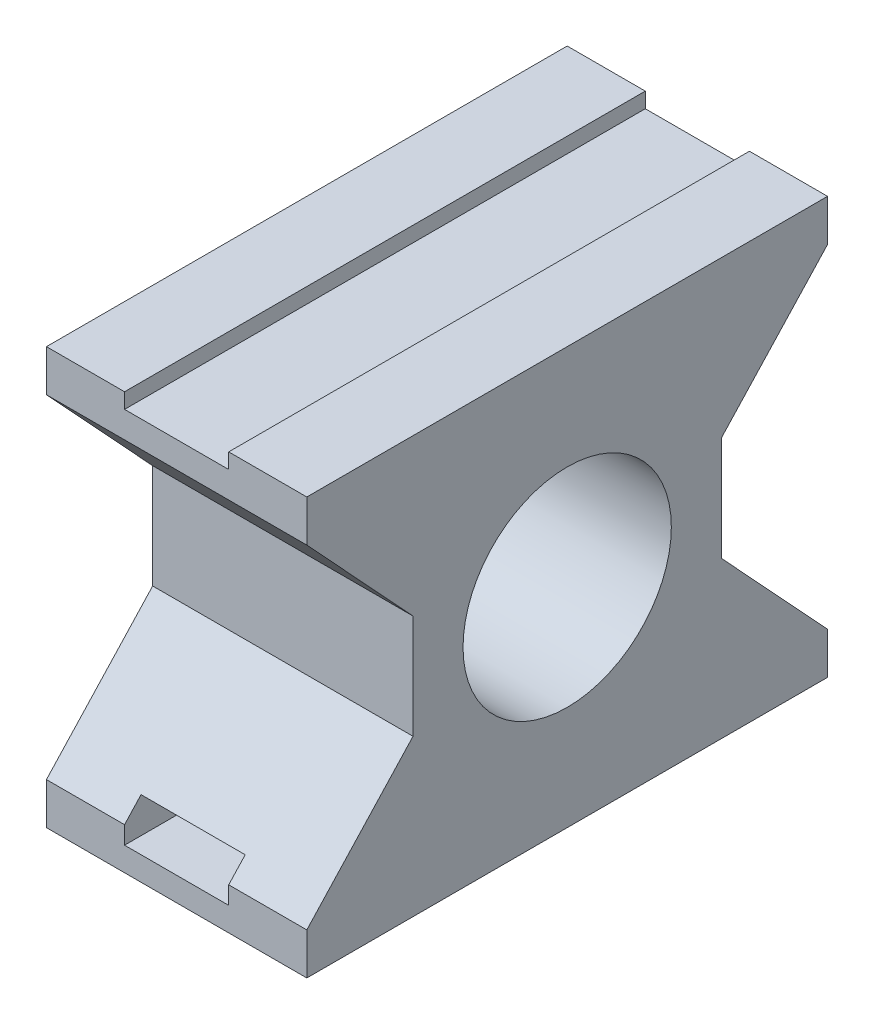
ISO-10303-21;
HEADER;
FILE_DESCRIPTION(('STEP AP214'),'2;1');
FILE_NAME('part.step','',(''),(''),'','','');
FILE_SCHEMA(('AUTOMOTIVE_DESIGN { 1 0 10303 214 1 1 1 1 }'));
ENDSEC;
DATA;
#1=APPLICATION_CONTEXT('core data for automotive mechanical design processes');
#2=APPLICATION_PROTOCOL_DEFINITION('international standard','automotive_design',2000,#1);
#3=PRODUCT_CONTEXT('',#1,'mechanical');
#4=PRODUCT('Part','Part','',(#3));
#5=PRODUCT_RELATED_PRODUCT_CATEGORY('part','',(#4));
#6=PRODUCT_DEFINITION_FORMATION('','',#4);
#7=PRODUCT_DEFINITION_CONTEXT('part definition',#1,'design');
#8=PRODUCT_DEFINITION('design','',#6,#7);
#9=PRODUCT_DEFINITION_SHAPE('','',#8);
#10=(LENGTH_UNIT() NAMED_UNIT(*) SI_UNIT(.MILLI.,.METRE.));
#11=(NAMED_UNIT(*) PLANE_ANGLE_UNIT() SI_UNIT($,.RADIAN.));
#12=(NAMED_UNIT(*) SI_UNIT($,.STERADIAN.) SOLID_ANGLE_UNIT());
#13=UNCERTAINTY_MEASURE_WITH_UNIT(LENGTH_MEASURE(1.E-05),#10,'distance_accuracy_value','');
#14=(GEOMETRIC_REPRESENTATION_CONTEXT(3) GLOBAL_UNCERTAINTY_ASSIGNED_CONTEXT((#13)) GLOBAL_UNIT_ASSIGNED_CONTEXT((#10,
#11,#12)) REPRESENTATION_CONTEXT('',''));
#15=CARTESIAN_POINT('',(0.,0.,0.));
#16=DIRECTION('',(0.,0.,1.));
#17=DIRECTION('',(1.,0.,0.));
#18=AXIS2_PLACEMENT_3D('',#15,#16,#17);
#19=CARTESIAN_POINT('',(50.,40.7131379883337,-29.5249111611344));
#20=DIRECTION('',(0.,-1.,0.));
#21=DIRECTION('',(0.,0.,-1.));
#22=AXIS2_PLACEMENT_3D('',#19,#20,#21);
#23=PLANE('',#22);
#24=DIRECTION('',(-1.,0.,0.));
#25=VECTOR('',#24,1.);
#26=CARTESIAN_POINT('',(50.,40.7131379883337,-29.5249111611344));
#27=LINE('',#26,#25);
#28=CARTESIAN_POINT('',(50.,40.7131379883337,-29.5249111611344));
#29=VERTEX_POINT('',#28);
#30=CARTESIAN_POINT('',(35.,40.7131379883337,-29.5249111611344));
#31=VERTEX_POINT('',#30);
#32=EDGE_CURVE('E310',#29,#31,#27,.T.);
#33=ORIENTED_EDGE('',*,*,#32,.T.);
#34=DIRECTION('',(0.,0.,1.));
#35=VECTOR('',#34,1.);
#36=CARTESIAN_POINT('',(35.,40.7131379883337,-29.5249111611344));
#37=LINE('',#36,#35);
#38=CARTESIAN_POINT('',(35.,40.7131379883337,70.4750888388656));
#39=VERTEX_POINT('',#38);
#40=EDGE_CURVE('E347',#31,#39,#37,.T.);
#41=ORIENTED_EDGE('',*,*,#40,.T.);
#42=DIRECTION('',(-1.,0.,0.));
#43=VECTOR('',#42,1.);
#44=CARTESIAN_POINT('',(50.,40.7131379883337,70.4750888388656));
#45=LINE('',#44,#43);
#46=CARTESIAN_POINT('',(50.,40.7131379883337,70.4750888388656));
#47=VERTEX_POINT('',#46);
#48=EDGE_CURVE('E307',#47,#39,#45,.T.);
#49=ORIENTED_EDGE('',*,*,#48,.F.);
#50=DIRECTION('',(0.,0.,1.));
#51=VECTOR('',#50,1.);
#52=CARTESIAN_POINT('',(50.,40.7131379883337,-29.5249111611344));
#53=LINE('',#52,#51);
#54=EDGE_CURVE('E278',#29,#47,#53,.T.);
#55=ORIENTED_EDGE('',*,*,#54,.F.);
#56=EDGE_LOOP('',(#33,#41,#49,#55));
#57=FACE_BOUND('',#56,.T.);
#58=ADVANCED_FACE('F33',(#57),#23,.F.);
#59=CARTESIAN_POINT('',(50.,0.,0.));
#60=DIRECTION('',(1.,0.,0.));
#61=DIRECTION('',(0.,0.,-1.));
#62=AXIS2_PLACEMENT_3D('',#59,#60,#61);
#63=PLANE('',#62);
#64=DIRECTION('',(0.,-1.,0.));
#65=VECTOR('',#64,1.);
#66=CARTESIAN_POINT('',(50.,40.7131379883337,70.4750888388656));
#67=LINE('',#66,#65);
#68=CARTESIAN_POINT('',(50.,32.7131379883336,70.4750888388656));
#69=VERTEX_POINT('',#68);
#70=EDGE_CURVE('E254',#47,#69,#67,.T.);
#71=ORIENTED_EDGE('',*,*,#70,.T.);
#72=DIRECTION('',(0.,-0.733333333333334,-0.679869268479038));
#73=VECTOR('',#72,1.);
#74=CARTESIAN_POINT('',(50.,32.7131379883336,70.4750888388656));
#75=LINE('',#74,#73);
#76=CARTESIAN_POINT('',(50.,10.7131379883337,50.0790107844945));
#77=VERTEX_POINT('',#76);
#78=EDGE_CURVE('E257',#69,#77,#75,.T.);
#79=ORIENTED_EDGE('',*,*,#78,.T.);
#80=DIRECTION('',(0.,-1.,0.));
#81=VECTOR('',#80,1.);
#82=CARTESIAN_POINT('',(50.,10.7131379883337,50.0790107844945));
#83=LINE('',#82,#81);
#84=CARTESIAN_POINT('',(50.,-9.28686201166634,50.0790107844945));
#85=VERTEX_POINT('',#84);
#86=EDGE_CURVE('E260',#77,#85,#83,.T.);
#87=ORIENTED_EDGE('',*,*,#86,.T.);
#88=DIRECTION('',(0.,-0.733333333333334,0.679869268479038));
#89=VECTOR('',#88,1.);
#90=CARTESIAN_POINT('',(50.,-9.28686201166634,50.0790107844945));
#91=LINE('',#90,#89);
#92=CARTESIAN_POINT('',(50.,-31.2868620116663,70.4750888388656));
#93=VERTEX_POINT('',#92);
#94=EDGE_CURVE('E262',#85,#93,#91,.T.);
#95=ORIENTED_EDGE('',*,*,#94,.T.);
#96=DIRECTION('',(0.,-1.,0.));
#97=VECTOR('',#96,1.);
#98=CARTESIAN_POINT('',(50.,-31.2868620116663,70.4750888388656));
#99=LINE('',#98,#97);
#100=CARTESIAN_POINT('',(50.,-39.2868620116664,70.4750888388656));
#101=VERTEX_POINT('',#100);
#102=EDGE_CURVE('E264',#93,#101,#99,.T.);
#103=ORIENTED_EDGE('',*,*,#102,.T.);
#104=DIRECTION('',(0.,0.,-1.));
#105=VECTOR('',#104,1.);
#106=CARTESIAN_POINT('',(50.,-39.2868620116664,70.4750888388656));
#107=LINE('',#106,#105);
#108=CARTESIAN_POINT('',(50.,-39.2868620116664,-29.5249111611344));
#109=VERTEX_POINT('',#108);
#110=EDGE_CURVE('E266',#101,#109,#107,.T.);
#111=ORIENTED_EDGE('',*,*,#110,.T.);
#112=DIRECTION('',(0.,1.,0.));
#113=VECTOR('',#112,1.);
#114=CARTESIAN_POINT('',(50.,-31.2868620116663,-29.5249111611344));
#115=LINE('',#114,#113);
#116=CARTESIAN_POINT('',(50.,-31.2868620116663,-29.5249111611344));
#117=VERTEX_POINT('',#116);
#118=EDGE_CURVE('E268',#109,#117,#115,.T.);
#119=ORIENTED_EDGE('',*,*,#118,.T.);
#120=DIRECTION('',(0.,0.733333333333334,0.679869268479038));
#121=VECTOR('',#120,1.);
#122=CARTESIAN_POINT('',(50.,-9.28686201166634,-9.1288331067633));
#123=LINE('',#122,#121);
#124=CARTESIAN_POINT('',(50.,-9.28686201166634,-9.1288331067633));
#125=VERTEX_POINT('',#124);
#126=EDGE_CURVE('E270',#117,#125,#123,.T.);
#127=ORIENTED_EDGE('',*,*,#126,.T.);
#128=DIRECTION('',(0.,1.,0.));
#129=VECTOR('',#128,1.);
#130=CARTESIAN_POINT('',(50.,10.7131379883337,-9.1288331067633));
#131=LINE('',#130,#129);
#132=CARTESIAN_POINT('',(50.,10.7131379883337,-9.1288331067633));
#133=VERTEX_POINT('',#132);
#134=EDGE_CURVE('E272',#125,#133,#131,.T.);
#135=ORIENTED_EDGE('',*,*,#134,.T.);
#136=DIRECTION('',(0.,0.733333333333334,-0.679869268479038));
#137=VECTOR('',#136,1.);
#138=CARTESIAN_POINT('',(50.,32.7131379883336,-29.5249111611344));
#139=LINE('',#138,#137);
#140=CARTESIAN_POINT('',(50.,32.7131379883336,-29.5249111611344));
#141=VERTEX_POINT('',#140);
#142=EDGE_CURVE('E274',#133,#141,#139,.T.);
#143=ORIENTED_EDGE('',*,*,#142,.T.);
#144=DIRECTION('',(0.,1.,0.));
#145=VECTOR('',#144,1.);
#146=CARTESIAN_POINT('',(50.,40.7131379883337,-29.5249111611344));
#147=LINE('',#146,#145);
#148=EDGE_CURVE('E276',#141,#29,#147,.T.);
#149=ORIENTED_EDGE('',*,*,#148,.T.);
#150=ORIENTED_EDGE('',*,*,#54,.T.);
#151=EDGE_LOOP('',(#71,#79,#87,#95,#103,#111,#119,#127,#135,#143,#149,#150));
#152=FACE_BOUND('',#151,.T.);
#153=CARTESIAN_POINT('',(50.,0.713137988333654,20.4750888388656));
#154=DIRECTION('',(1.,0.,0.));
#155=DIRECTION('',(0.,0.,-1.));
#156=AXIS2_PLACEMENT_3D('',#153,#154,#155);
#157=CIRCLE('',#156,20.);
#158=CARTESIAN_POINT('',(50.,0.713137988333654,0.475088838865576));
#159=VERTEX_POINT('',#158);
#160=EDGE_CURVE('E248',#159,#159,#157,.T.);
#161=ORIENTED_EDGE('',*,*,#160,.F.);
#162=EDGE_LOOP('',(#161));
#163=FACE_BOUND('',#162,.T.);
#164=ADVANCED_FACE('F377',(#152,#163),#63,.T.);
#165=CARTESIAN_POINT('',(0.,0.,0.));
#166=DIRECTION('',(1.,0.,0.));
#167=DIRECTION('',(0.,0.,-1.));
#168=AXIS2_PLACEMENT_3D('',#165,#166,#167);
#169=PLANE('',#168);
#170=DIRECTION('',(0.,-1.,0.));
#171=VECTOR('',#170,1.);
#172=CARTESIAN_POINT('',(0.,40.7131379883337,70.4750888388656));
#173=LINE('',#172,#171);
#174=CARTESIAN_POINT('',(0.,40.7131379883337,70.4750888388656));
#175=VERTEX_POINT('',#174);
#176=CARTESIAN_POINT('',(0.,32.7131379883336,70.4750888388656));
#177=VERTEX_POINT('',#176);
#178=EDGE_CURVE('E251',#175,#177,#173,.T.);
#179=ORIENTED_EDGE('',*,*,#178,.F.);
#180=DIRECTION('',(0.,0.,1.));
#181=VECTOR('',#180,1.);
#182=CARTESIAN_POINT('',(0.,40.7131379883337,-29.5249111611344));
#183=LINE('',#182,#181);
#184=CARTESIAN_POINT('',(0.,40.7131379883337,-29.5249111611344));
#185=VERTEX_POINT('',#184);
#186=EDGE_CURVE('E258',#185,#175,#183,.T.);
#187=ORIENTED_EDGE('',*,*,#186,.F.);
#188=DIRECTION('',(0.,1.,0.));
#189=VECTOR('',#188,1.);
#190=CARTESIAN_POINT('',(0.,40.7131379883337,-29.5249111611344));
#191=LINE('',#190,#189);
#192=CARTESIAN_POINT('',(0.,32.7131379883336,-29.5249111611344));
#193=VERTEX_POINT('',#192);
#194=EDGE_CURVE('E303',#193,#185,#191,.T.);
#195=ORIENTED_EDGE('',*,*,#194,.F.);
#196=DIRECTION('',(0.,0.733333333333334,-0.679869268479038));
#197=VECTOR('',#196,1.);
#198=CARTESIAN_POINT('',(0.,32.7131379883336,-29.5249111611344));
#199=LINE('',#198,#197);
#200=CARTESIAN_POINT('',(0.,10.7131379883337,-9.1288331067633));
#201=VERTEX_POINT('',#200);
#202=EDGE_CURVE('E301',#201,#193,#199,.T.);
#203=ORIENTED_EDGE('',*,*,#202,.F.);
#204=DIRECTION('',(0.,1.,0.));
#205=VECTOR('',#204,1.);
#206=CARTESIAN_POINT('',(0.,10.7131379883337,-9.1288331067633));
#207=LINE('',#206,#205);
#208=CARTESIAN_POINT('',(0.,-9.28686201166634,-9.1288331067633));
#209=VERTEX_POINT('',#208);
#210=EDGE_CURVE('E299',#209,#201,#207,.T.);
#211=ORIENTED_EDGE('',*,*,#210,.F.);
#212=DIRECTION('',(0.,0.733333333333334,0.679869268479038));
#213=VECTOR('',#212,1.);
#214=CARTESIAN_POINT('',(0.,-9.28686201166634,-9.1288331067633));
#215=LINE('',#214,#213);
#216=CARTESIAN_POINT('',(0.,-31.2868620116663,-29.5249111611344));
#217=VERTEX_POINT('',#216);
#218=EDGE_CURVE('E297',#217,#209,#215,.T.);
#219=ORIENTED_EDGE('',*,*,#218,.F.);
#220=DIRECTION('',(0.,1.,0.));
#221=VECTOR('',#220,1.);
#222=CARTESIAN_POINT('',(0.,-31.2868620116663,-29.5249111611344));
#223=LINE('',#222,#221);
#224=CARTESIAN_POINT('',(0.,-39.2868620116664,-29.5249111611344));
#225=VERTEX_POINT('',#224);
#226=EDGE_CURVE('E294',#225,#217,#223,.T.);
#227=ORIENTED_EDGE('',*,*,#226,.F.);
#228=DIRECTION('',(0.,0.,-1.));
#229=VECTOR('',#228,1.);
#230=CARTESIAN_POINT('',(0.,-39.2868620116664,70.4750888388656));
#231=LINE('',#230,#229);
#232=CARTESIAN_POINT('',(0.,-39.2868620116664,70.4750888388656));
#233=VERTEX_POINT('',#232);
#234=EDGE_CURVE('E292',#233,#225,#231,.T.);
#235=ORIENTED_EDGE('',*,*,#234,.F.);
#236=DIRECTION('',(0.,-1.,0.));
#237=VECTOR('',#236,1.);
#238=CARTESIAN_POINT('',(0.,-31.2868620116663,70.4750888388656));
#239=LINE('',#238,#237);
#240=CARTESIAN_POINT('',(0.,-31.2868620116663,70.4750888388656));
#241=VERTEX_POINT('',#240);
#242=EDGE_CURVE('E290',#241,#233,#239,.T.);
#243=ORIENTED_EDGE('',*,*,#242,.F.);
#244=DIRECTION('',(0.,-0.733333333333334,0.679869268479038));
#245=VECTOR('',#244,1.);
#246=CARTESIAN_POINT('',(0.,-9.28686201166634,50.0790107844945));
#247=LINE('',#246,#245);
#248=CARTESIAN_POINT('',(0.,-9.28686201166634,50.0790107844945));
#249=VERTEX_POINT('',#248);
#250=EDGE_CURVE('E287',#249,#241,#247,.T.);
#251=ORIENTED_EDGE('',*,*,#250,.F.);
#252=DIRECTION('',(0.,-1.,0.));
#253=VECTOR('',#252,1.);
#254=CARTESIAN_POINT('',(0.,10.7131379883337,50.0790107844945));
#255=LINE('',#254,#253);
#256=CARTESIAN_POINT('',(0.,10.7131379883337,50.0790107844945));
#257=VERTEX_POINT('',#256);
#258=EDGE_CURVE('E285',#257,#249,#255,.T.);
#259=ORIENTED_EDGE('',*,*,#258,.F.);
#260=DIRECTION('',(0.,-0.733333333333334,-0.679869268479038));
#261=VECTOR('',#260,1.);
#262=CARTESIAN_POINT('',(0.,32.7131379883336,70.4750888388656));
#263=LINE('',#262,#261);
#264=EDGE_CURVE('E283',#177,#257,#263,.T.);
#265=ORIENTED_EDGE('',*,*,#264,.F.);
#266=EDGE_LOOP('',(#179,#187,#195,#203,#211,#219,#227,#235,#243,#251,#259,#265));
#267=FACE_BOUND('',#266,.T.);
#268=CARTESIAN_POINT('',(0.,0.713137988333654,20.4750888388656));
#269=DIRECTION('',(1.,0.,0.));
#270=DIRECTION('',(0.,0.,-1.));
#271=AXIS2_PLACEMENT_3D('',#268,#269,#270);
#272=CIRCLE('',#271,20.);
#273=CARTESIAN_POINT('',(0.,0.713137988333654,0.475088838865576));
#274=VERTEX_POINT('',#273);
#275=EDGE_CURVE('E247',#274,#274,#272,.T.);
#276=ORIENTED_EDGE('',*,*,#275,.T.);
#277=EDGE_LOOP('',(#276));
#278=FACE_BOUND('',#277,.T.);
#279=ADVANCED_FACE('F366',(#267,#278),#169,.F.);
#280=CARTESIAN_POINT('',(50.,40.7131379883337,70.4750888388656));
#281=DIRECTION('',(0.,0.,-1.));
#282=DIRECTION('',(-1.,0.,0.));
#283=AXIS2_PLACEMENT_3D('',#280,#281,#282);
#284=PLANE('',#283);
#285=ORIENTED_EDGE('',*,*,#48,.T.);
#286=DIRECTION('',(0.,1.,0.));
#287=VECTOR('',#286,1.);
#288=CARTESIAN_POINT('',(35.,43.6468692656229,70.4750888388656));
#289=LINE('',#288,#287);
#290=CARTESIAN_POINT('',(35.,37.7794067110444,70.4750888388656));
#291=VERTEX_POINT('',#290);
#292=EDGE_CURVE('E210',#291,#39,#289,.T.);
#293=ORIENTED_EDGE('',*,*,#292,.F.);
#294=DIRECTION('',(1.,0.,0.));
#295=VECTOR('',#294,1.);
#296=CARTESIAN_POINT('',(15.,37.7794067110444,70.4750888388656));
#297=LINE('',#296,#295);
#298=CARTESIAN_POINT('',(15.,37.7794067110444,70.4750888388656));
#299=VERTEX_POINT('',#298);
#300=EDGE_CURVE('E207',#299,#291,#297,.T.);
#301=ORIENTED_EDGE('',*,*,#300,.F.);
#302=DIRECTION('',(0.,-1.,0.));
#303=VECTOR('',#302,1.);
#304=CARTESIAN_POINT('',(15.,43.6468692656229,70.4750888388656));
#305=LINE('',#304,#303);
#306=CARTESIAN_POINT('',(15.,40.7131379883337,70.4750888388656));
#307=VERTEX_POINT('',#306);
#308=EDGE_CURVE('E188',#307,#299,#305,.T.);
#309=ORIENTED_EDGE('',*,*,#308,.F.);
#310=EDGE_CURVE('E280',#307,#175,#45,.T.);
#311=ORIENTED_EDGE('',*,*,#310,.T.);
#312=ORIENTED_EDGE('',*,*,#178,.T.);
#313=DIRECTION('',(-1.,0.,0.));
#314=VECTOR('',#313,1.);
#315=CARTESIAN_POINT('',(50.,32.7131379883336,70.4750888388656));
#316=LINE('',#315,#314);
#317=EDGE_CURVE('E342',#69,#177,#316,.T.);
#318=ORIENTED_EDGE('',*,*,#317,.F.);
#319=ORIENTED_EDGE('',*,*,#70,.F.);
#320=EDGE_LOOP('',(#285,#293,#301,#309,#311,#312,#318,#319));
#321=FACE_BOUND('',#320,.T.);
#322=ADVANCED_FACE('F35',(#321),#284,.F.);
#323=CARTESIAN_POINT('',(50.,32.7131379883336,70.4750888388656));
#324=DIRECTION('',(0.,0.679869268479038,-0.733333333333334));
#325=DIRECTION('',(0.,0.733333333333334,0.679869268479038));
#326=AXIS2_PLACEMENT_3D('',#323,#324,#325);
#327=PLANE('',#326);
#328=ORIENTED_EDGE('',*,*,#264,.T.);
#329=DIRECTION('',(-1.,0.,0.));
#330=VECTOR('',#329,1.);
#331=CARTESIAN_POINT('',(50.,10.7131379883337,50.0790107844945));
#332=LINE('',#331,#330);
#333=EDGE_CURVE('E339',#77,#257,#332,.T.);
#334=ORIENTED_EDGE('',*,*,#333,.F.);
#335=ORIENTED_EDGE('',*,*,#78,.F.);
#336=ORIENTED_EDGE('',*,*,#317,.T.);
#337=EDGE_LOOP('',(#328,#334,#335,#336));
#338=FACE_BOUND('',#337,.T.);
#339=ADVANCED_FACE('F454',(#338),#327,.F.);
#340=CARTESIAN_POINT('',(50.,10.7131379883337,50.0790107844945));
#341=DIRECTION('',(0.,0.,-1.));
#342=DIRECTION('',(0.,1.,0.));
#343=AXIS2_PLACEMENT_3D('',#340,#341,#342);
#344=PLANE('',#343);
#345=ORIENTED_EDGE('',*,*,#258,.T.);
#346=DIRECTION('',(-1.,0.,0.));
#347=VECTOR('',#346,1.);
#348=CARTESIAN_POINT('',(50.,-9.28686201166634,50.0790107844945));
#349=LINE('',#348,#347);
#350=EDGE_CURVE('E336',#85,#249,#349,.T.);
#351=ORIENTED_EDGE('',*,*,#350,.F.);
#352=ORIENTED_EDGE('',*,*,#86,.F.);
#353=ORIENTED_EDGE('',*,*,#333,.T.);
#354=EDGE_LOOP('',(#345,#351,#352,#353));
#355=FACE_BOUND('',#354,.T.);
#356=ADVANCED_FACE('F407',(#355),#344,.F.);
#357=CARTESIAN_POINT('',(50.,-9.28686201166634,50.0790107844945));
#358=DIRECTION('',(0.,-0.679869268479038,-0.733333333333334));
#359=DIRECTION('',(0.,0.733333333333334,-0.679869268479038));
#360=AXIS2_PLACEMENT_3D('',#357,#358,#359);
#361=PLANE('',#360);
#362=DIRECTION('',(1.,0.,0.));
#363=VECTOR('',#362,1.);
#364=CARTESIAN_POINT('',(50.,-27.8720607072948,67.3092454777688));
#365=LINE('',#364,#363);
#366=CARTESIAN_POINT('',(15.,-27.8720607072948,67.3092454777688));
#367=VERTEX_POINT('',#366);
#368=CARTESIAN_POINT('',(35.,-27.8720607072948,67.3092454777688));
#369=VERTEX_POINT('',#368);
#370=EDGE_CURVE('E215',#367,#369,#365,.T.);
#371=ORIENTED_EDGE('',*,*,#370,.T.);
#372=DIRECTION('',(0.,-0.733333333333334,0.679869268479038));
#373=VECTOR('',#372,1.);
#374=CARTESIAN_POINT('',(35.0000000000001,-9.28686201166633,50.0790107844944));
#375=LINE('',#374,#373);
#376=CARTESIAN_POINT('',(35.,-31.2868620116663,70.4750888388656));
#377=VERTEX_POINT('',#376);
#378=EDGE_CURVE('E244',#369,#377,#375,.T.);
#379=ORIENTED_EDGE('',*,*,#378,.T.);
#380=DIRECTION('',(-1.,0.,0.));
#381=VECTOR('',#380,1.);
#382=CARTESIAN_POINT('',(50.,-31.2868620116663,70.4750888388656));
#383=LINE('',#382,#381);
#384=EDGE_CURVE('E333',#93,#377,#383,.T.);
#385=ORIENTED_EDGE('',*,*,#384,.F.);
#386=ORIENTED_EDGE('',*,*,#94,.F.);
#387=ORIENTED_EDGE('',*,*,#350,.T.);
#388=ORIENTED_EDGE('',*,*,#250,.T.);
#389=CARTESIAN_POINT('',(15.,-31.2868620116663,70.4750888388656));
#390=VERTEX_POINT('',#389);
#391=EDGE_CURVE('E332',#390,#241,#383,.T.);
#392=ORIENTED_EDGE('',*,*,#391,.F.);
#393=DIRECTION('',(0.,0.733333333333334,-0.679869268479038));
#394=VECTOR('',#393,1.);
#395=CARTESIAN_POINT('',(15.,-9.28686201166634,50.0790107844945));
#396=LINE('',#395,#394);
#397=EDGE_CURVE('E48',#390,#367,#396,.T.);
#398=ORIENTED_EDGE('',*,*,#397,.T.);
#399=EDGE_LOOP('',(#371,#379,#385,#386,#387,#388,#392,#398));
#400=FACE_BOUND('',#399,.T.);
#401=ADVANCED_FACE('F388',(#400),#361,.F.);
#402=CARTESIAN_POINT('',(50.,-31.2868620116663,70.4750888388656));
#403=DIRECTION('',(0.,0.,-1.));
#404=DIRECTION('',(-1.,0.,0.));
#405=AXIS2_PLACEMENT_3D('',#402,#403,#404);
#406=PLANE('',#405);
#407=ORIENTED_EDGE('',*,*,#384,.T.);
#408=DIRECTION('',(0.,1.,0.));
#409=VECTOR('',#408,1.);
#410=CARTESIAN_POINT('',(35.,-27.8720607072948,70.4750888388656));
#411=LINE('',#410,#409);
#412=CARTESIAN_POINT('',(35.,-34.7016633160379,70.4750888388656));
#413=VERTEX_POINT('',#412);
#414=EDGE_CURVE('E228',#413,#377,#411,.T.);
#415=ORIENTED_EDGE('',*,*,#414,.F.);
#416=DIRECTION('',(1.,0.,0.));
#417=VECTOR('',#416,1.);
#418=CARTESIAN_POINT('',(15.,-34.7016633160379,70.4750888388656));
#419=LINE('',#418,#417);
#420=CARTESIAN_POINT('',(15.,-34.7016633160379,70.4750888388656));
#421=VERTEX_POINT('',#420);
#422=EDGE_CURVE('E221',#421,#413,#419,.T.);
#423=ORIENTED_EDGE('',*,*,#422,.F.);
#424=DIRECTION('',(0.,-1.,0.));
#425=VECTOR('',#424,1.);
#426=CARTESIAN_POINT('',(15.,-27.8720607072948,70.4750888388656));
#427=LINE('',#426,#425);
#428=EDGE_CURVE('E230',#390,#421,#427,.T.);
#429=ORIENTED_EDGE('',*,*,#428,.F.);
#430=ORIENTED_EDGE('',*,*,#391,.T.);
#431=ORIENTED_EDGE('',*,*,#242,.T.);
#432=DIRECTION('',(-1.,0.,0.));
#433=VECTOR('',#432,1.);
#434=CARTESIAN_POINT('',(50.,-39.2868620116664,70.4750888388656));
#435=LINE('',#434,#433);
#436=EDGE_CURVE('E329',#101,#233,#435,.T.);
#437=ORIENTED_EDGE('',*,*,#436,.F.);
#438=ORIENTED_EDGE('',*,*,#102,.F.);
#439=EDGE_LOOP('',(#407,#415,#423,#429,#430,#431,#437,#438));
#440=FACE_BOUND('',#439,.T.);
#441=ADVANCED_FACE('F394',(#440),#406,.F.);
#442=CARTESIAN_POINT('',(50.,-39.2868620116664,70.4750888388656));
#443=DIRECTION('',(0.,1.,0.));
#444=DIRECTION('',(0.,0.,1.));
#445=AXIS2_PLACEMENT_3D('',#442,#443,#444);
#446=PLANE('',#445);
#447=ORIENTED_EDGE('',*,*,#234,.T.);
#448=DIRECTION('',(-1.,0.,0.));
#449=VECTOR('',#448,1.);
#450=CARTESIAN_POINT('',(50.,-39.2868620116664,-29.5249111611344));
#451=LINE('',#450,#449);
#452=EDGE_CURVE('E326',#109,#225,#451,.T.);
#453=ORIENTED_EDGE('',*,*,#452,.F.);
#454=ORIENTED_EDGE('',*,*,#110,.F.);
#455=ORIENTED_EDGE('',*,*,#436,.T.);
#456=EDGE_LOOP('',(#447,#453,#454,#455));
#457=FACE_BOUND('',#456,.T.);
#458=ADVANCED_FACE('F410',(#457),#446,.F.);
#459=CARTESIAN_POINT('',(50.,-31.2868620116663,-29.5249111611344));
#460=DIRECTION('',(0.,0.,1.));
#461=DIRECTION('',(1.,0.,0.));
#462=AXIS2_PLACEMENT_3D('',#459,#460,#461);
#463=PLANE('',#462);
#464=DIRECTION('',(1.,0.,0.));
#465=VECTOR('',#464,1.);
#466=CARTESIAN_POINT('',(15.,-34.7016633160379,-29.5249111611344));
#467=LINE('',#466,#465);
#468=CARTESIAN_POINT('',(15.,-34.7016633160379,-29.5249111611344));
#469=VERTEX_POINT('',#468);
#470=CARTESIAN_POINT('',(35.,-34.7016633160379,-29.5249111611344));
#471=VERTEX_POINT('',#470);
#472=EDGE_CURVE('E224',#469,#471,#467,.T.);
#473=ORIENTED_EDGE('',*,*,#472,.T.);
#474=DIRECTION('',(0.,1.,0.));
#475=VECTOR('',#474,1.);
#476=CARTESIAN_POINT('',(35.,-27.8720607072948,-29.5249111611344));
#477=LINE('',#476,#475);
#478=CARTESIAN_POINT('',(35.,-31.2868620116663,-29.5249111611344));
#479=VERTEX_POINT('',#478);
#480=EDGE_CURVE('E217',#471,#479,#477,.T.);
#481=ORIENTED_EDGE('',*,*,#480,.T.);
#482=DIRECTION('',(-1.,0.,0.));
#483=VECTOR('',#482,1.);
#484=CARTESIAN_POINT('',(50.,-31.2868620116663,-29.5249111611344));
#485=LINE('',#484,#483);
#486=EDGE_CURVE('E323',#117,#479,#485,.T.);
#487=ORIENTED_EDGE('',*,*,#486,.F.);
#488=ORIENTED_EDGE('',*,*,#118,.F.);
#489=ORIENTED_EDGE('',*,*,#452,.T.);
#490=ORIENTED_EDGE('',*,*,#226,.T.);
#491=CARTESIAN_POINT('',(15.,-31.2868620116663,-29.5249111611344));
#492=VERTEX_POINT('',#491);
#493=EDGE_CURVE('E322',#492,#217,#485,.T.);
#494=ORIENTED_EDGE('',*,*,#493,.F.);
#495=DIRECTION('',(0.,-1.,0.));
#496=VECTOR('',#495,1.);
#497=CARTESIAN_POINT('',(15.,-27.8720607072948,-29.5249111611344));
#498=LINE('',#497,#496);
#499=EDGE_CURVE('E220',#492,#469,#498,.T.);
#500=ORIENTED_EDGE('',*,*,#499,.T.);
#501=EDGE_LOOP('',(#473,#481,#487,#488,#489,#490,#494,#500));
#502=FACE_BOUND('',#501,.T.);
#503=ADVANCED_FACE('F357',(#502),#463,.F.);
#504=CARTESIAN_POINT('',(50.,-9.28686201166634,-9.1288331067633));
#505=DIRECTION('',(0.,-0.679869268479038,0.733333333333334));
#506=DIRECTION('',(0.,-0.733333333333334,-0.679869268479038));
#507=AXIS2_PLACEMENT_3D('',#504,#505,#506);
#508=PLANE('',#507);
#509=ORIENTED_EDGE('',*,*,#486,.T.);
#510=DIRECTION('',(0.,0.733333333333334,0.679869268479038));
#511=VECTOR('',#510,1.);
#512=CARTESIAN_POINT('',(35.0000000000001,-9.28686201166633,-9.12883310676328));
#513=LINE('',#512,#511);
#514=CARTESIAN_POINT('',(35.,-27.8720607072948,-26.3590678000376));
#515=VERTEX_POINT('',#514);
#516=EDGE_CURVE('E11',#479,#515,#513,.T.);
#517=ORIENTED_EDGE('',*,*,#516,.T.);
#518=DIRECTION('',(-1.,0.,0.));
#519=VECTOR('',#518,1.);
#520=CARTESIAN_POINT('',(50.,-27.8720607072948,-26.3590678000376));
#521=LINE('',#520,#519);
#522=CARTESIAN_POINT('',(15.,-27.8720607072948,-26.3590678000376));
#523=VERTEX_POINT('',#522);
#524=EDGE_CURVE('E350',#515,#523,#521,.T.);
#525=ORIENTED_EDGE('',*,*,#524,.T.);
#526=DIRECTION('',(0.,-0.733333333333334,-0.679869268479038));
#527=VECTOR('',#526,1.);
#528=CARTESIAN_POINT('',(15.,-9.28686201166634,-9.1288331067633));
#529=LINE('',#528,#527);
#530=EDGE_CURVE('E41',#523,#492,#529,.T.);
#531=ORIENTED_EDGE('',*,*,#530,.T.);
#532=ORIENTED_EDGE('',*,*,#493,.T.);
#533=ORIENTED_EDGE('',*,*,#218,.T.);
#534=DIRECTION('',(-1.,0.,0.));
#535=VECTOR('',#534,1.);
#536=CARTESIAN_POINT('',(50.,-9.28686201166634,-9.1288331067633));
#537=LINE('',#536,#535);
#538=EDGE_CURVE('E319',#125,#209,#537,.T.);
#539=ORIENTED_EDGE('',*,*,#538,.F.);
#540=ORIENTED_EDGE('',*,*,#126,.F.);
#541=EDGE_LOOP('',(#509,#517,#525,#531,#532,#533,#539,#540));
#542=FACE_BOUND('',#541,.T.);
#543=ADVANCED_FACE('F355',(#542),#508,.F.);
#544=CARTESIAN_POINT('',(50.,10.7131379883337,-9.1288331067633));
#545=DIRECTION('',(0.,0.,1.));
#546=DIRECTION('',(0.,-1.,0.));
#547=AXIS2_PLACEMENT_3D('',#544,#545,#546);
#548=PLANE('',#547);
#549=ORIENTED_EDGE('',*,*,#210,.T.);
#550=DIRECTION('',(-1.,0.,0.));
#551=VECTOR('',#550,1.);
#552=CARTESIAN_POINT('',(50.,10.7131379883337,-9.1288331067633));
#553=LINE('',#552,#551);
#554=EDGE_CURVE('E316',#133,#201,#553,.T.);
#555=ORIENTED_EDGE('',*,*,#554,.F.);
#556=ORIENTED_EDGE('',*,*,#134,.F.);
#557=ORIENTED_EDGE('',*,*,#538,.T.);
#558=EDGE_LOOP('',(#549,#555,#556,#557));
#559=FACE_BOUND('',#558,.T.);
#560=ADVANCED_FACE('F373',(#559),#548,.F.);
#561=CARTESIAN_POINT('',(50.,32.7131379883336,-29.5249111611344));
#562=DIRECTION('',(0.,0.679869268479038,0.733333333333334));
#563=DIRECTION('',(0.,-0.733333333333334,0.679869268479038));
#564=AXIS2_PLACEMENT_3D('',#561,#562,#563);
#565=PLANE('',#564);
#566=ORIENTED_EDGE('',*,*,#202,.T.);
#567=DIRECTION('',(-1.,0.,0.));
#568=VECTOR('',#567,1.);
#569=CARTESIAN_POINT('',(50.,32.7131379883336,-29.5249111611344));
#570=LINE('',#569,#568);
#571=EDGE_CURVE('E313',#141,#193,#570,.T.);
#572=ORIENTED_EDGE('',*,*,#571,.F.);
#573=ORIENTED_EDGE('',*,*,#142,.F.);
#574=ORIENTED_EDGE('',*,*,#554,.T.);
#575=EDGE_LOOP('',(#566,#572,#573,#574));
#576=FACE_BOUND('',#575,.T.);
#577=ADVANCED_FACE('F440',(#576),#565,.F.);
#578=CARTESIAN_POINT('',(50.,40.7131379883337,-29.5249111611344));
#579=DIRECTION('',(0.,0.,1.));
#580=DIRECTION('',(1.,0.,0.));
#581=AXIS2_PLACEMENT_3D('',#578,#579,#580);
#582=PLANE('',#581);
#583=DIRECTION('',(1.,0.,0.));
#584=VECTOR('',#583,1.);
#585=CARTESIAN_POINT('',(15.,37.7794067110444,-29.5249111611344));
#586=LINE('',#585,#584);
#587=CARTESIAN_POINT('',(15.,37.7794067110444,-29.5249111611344));
#588=VERTEX_POINT('',#587);
#589=CARTESIAN_POINT('',(35.,37.7794067110444,-29.5249111611344));
#590=VERTEX_POINT('',#589);
#591=EDGE_CURVE('E193',#588,#590,#586,.T.);
#592=ORIENTED_EDGE('',*,*,#591,.T.);
#593=DIRECTION('',(0.,1.,0.));
#594=VECTOR('',#593,1.);
#595=CARTESIAN_POINT('',(35.,43.6468692656229,-29.5249111611344));
#596=LINE('',#595,#594);
#597=EDGE_CURVE('E205',#590,#31,#596,.T.);
#598=ORIENTED_EDGE('',*,*,#597,.T.);
#599=ORIENTED_EDGE('',*,*,#32,.F.);
#600=ORIENTED_EDGE('',*,*,#148,.F.);
#601=ORIENTED_EDGE('',*,*,#571,.T.);
#602=ORIENTED_EDGE('',*,*,#194,.T.);
#603=CARTESIAN_POINT('',(15.,40.7131379883337,-29.5249111611344));
#604=VERTEX_POINT('',#603);
#605=EDGE_CURVE('E204',#604,#185,#27,.T.);
#606=ORIENTED_EDGE('',*,*,#605,.F.);
#607=DIRECTION('',(0.,-1.,0.));
#608=VECTOR('',#607,1.);
#609=CARTESIAN_POINT('',(15.,43.6468692656229,-29.5249111611344));
#610=LINE('',#609,#608);
#611=EDGE_CURVE('E185',#604,#588,#610,.T.);
#612=ORIENTED_EDGE('',*,*,#611,.T.);
#613=EDGE_LOOP('',(#592,#598,#599,#600,#601,#602,#606,#612));
#614=FACE_BOUND('',#613,.T.);
#615=ADVANCED_FACE('F202',(#614),#582,.F.);
#616=ORIENTED_EDGE('',*,*,#310,.F.);
#617=DIRECTION('',(0.,0.,-1.));
#618=VECTOR('',#617,1.);
#619=CARTESIAN_POINT('',(15.,40.7131379883337,-29.5249111611344));
#620=LINE('',#619,#618);
#621=EDGE_CURVE('E345',#307,#604,#620,.T.);
#622=ORIENTED_EDGE('',*,*,#621,.T.);
#623=ORIENTED_EDGE('',*,*,#605,.T.);
#624=ORIENTED_EDGE('',*,*,#186,.T.);
#625=EDGE_LOOP('',(#616,#622,#623,#624));
#626=FACE_BOUND('',#625,.T.);
#627=ADVANCED_FACE('F423',(#626),#23,.F.);
#628=CARTESIAN_POINT('',(50.,0.713137988333654,20.4750888388656));
#629=DIRECTION('',(-1.,0.,0.));
#630=DIRECTION('',(0.,0.,1.));
#631=AXIS2_PLACEMENT_3D('',#628,#629,#630);
#632=CYLINDRICAL_SURFACE('',#631,20.);
#633=ORIENTED_EDGE('',*,*,#160,.T.);
#634=EDGE_LOOP('',(#633));
#635=FACE_BOUND('',#634,.T.);
#636=ORIENTED_EDGE('',*,*,#275,.F.);
#637=EDGE_LOOP('',(#636));
#638=FACE_BOUND('',#637,.T.);
#639=ADVANCED_FACE('F431',(#635,#638),#632,.F.);
#640=CARTESIAN_POINT('',(35.,43.6468692656229,-29.5249111611344));
#641=DIRECTION('',(1.,0.,0.));
#642=DIRECTION('',(0.,0.,-1.));
#643=AXIS2_PLACEMENT_3D('',#640,#641,#642);
#644=PLANE('',#643);
#645=ORIENTED_EDGE('',*,*,#597,.F.);
#646=DIRECTION('',(0.,0.,1.));
#647=VECTOR('',#646,1.);
#648=CARTESIAN_POINT('',(35.,37.7794067110444,-29.5249111611344));
#649=LINE('',#648,#647);
#650=EDGE_CURVE('E192',#590,#291,#649,.T.);
#651=ORIENTED_EDGE('',*,*,#650,.T.);
#652=ORIENTED_EDGE('',*,*,#292,.T.);
#653=ORIENTED_EDGE('',*,*,#40,.F.);
#654=EDGE_LOOP('',(#645,#651,#652,#653));
#655=FACE_BOUND('',#654,.T.);
#656=ADVANCED_FACE('F437',(#655),#644,.F.);
#657=CARTESIAN_POINT('',(15.,43.6468692656229,-29.5249111611344));
#658=DIRECTION('',(-1.,0.,0.));
#659=DIRECTION('',(0.,0.,1.));
#660=AXIS2_PLACEMENT_3D('',#657,#658,#659);
#661=PLANE('',#660);
#662=ORIENTED_EDGE('',*,*,#308,.T.);
#663=DIRECTION('',(0.,0.,1.));
#664=VECTOR('',#663,1.);
#665=CARTESIAN_POINT('',(15.,37.7794067110444,-29.5249111611344));
#666=LINE('',#665,#664);
#667=EDGE_CURVE('E181',#588,#299,#666,.T.);
#668=ORIENTED_EDGE('',*,*,#667,.F.);
#669=ORIENTED_EDGE('',*,*,#611,.F.);
#670=ORIENTED_EDGE('',*,*,#621,.F.);
#671=EDGE_LOOP('',(#662,#668,#669,#670));
#672=FACE_BOUND('',#671,.T.);
#673=ADVANCED_FACE('F183',(#672),#661,.F.);
#674=CARTESIAN_POINT('',(15.,37.7794067110444,-29.5249111611344));
#675=DIRECTION('',(0.,-1.,0.));
#676=DIRECTION('',(0.,0.,-1.));
#677=AXIS2_PLACEMENT_3D('',#674,#675,#676);
#678=PLANE('',#677);
#679=ORIENTED_EDGE('',*,*,#300,.T.);
#680=ORIENTED_EDGE('',*,*,#650,.F.);
#681=ORIENTED_EDGE('',*,*,#591,.F.);
#682=ORIENTED_EDGE('',*,*,#667,.T.);
#683=EDGE_LOOP('',(#679,#680,#681,#682));
#684=FACE_BOUND('',#683,.T.);
#685=ADVANCED_FACE('F196',(#684),#678,.F.);
#686=CARTESIAN_POINT('',(35.,-27.8720607072948,-29.5249111611344));
#687=DIRECTION('',(1.,0.,0.));
#688=DIRECTION('',(0.,1.,0.));
#689=AXIS2_PLACEMENT_3D('',#686,#687,#688);
#690=PLANE('',#689);
#691=DIRECTION('',(0.,0.,1.));
#692=VECTOR('',#691,1.);
#693=CARTESIAN_POINT('',(35.,-27.8720607072948,-29.5249111611344));
#694=LINE('',#693,#692);
#695=EDGE_CURVE('E227',#515,#369,#694,.T.);
#696=ORIENTED_EDGE('',*,*,#695,.F.);
#697=ORIENTED_EDGE('',*,*,#516,.F.);
#698=ORIENTED_EDGE('',*,*,#480,.F.);
#699=DIRECTION('',(0.,0.,1.));
#700=VECTOR('',#699,1.);
#701=CARTESIAN_POINT('',(35.,-34.7016633160379,-29.5249111611344));
#702=LINE('',#701,#700);
#703=EDGE_CURVE('E212',#471,#413,#702,.T.);
#704=ORIENTED_EDGE('',*,*,#703,.T.);
#705=ORIENTED_EDGE('',*,*,#414,.T.);
#706=ORIENTED_EDGE('',*,*,#378,.F.);
#707=EDGE_LOOP('',(#696,#697,#698,#704,#705,#706));
#708=FACE_BOUND('',#707,.T.);
#709=ADVANCED_FACE('F385',(#708),#690,.F.);
#710=CARTESIAN_POINT('',(15.,-27.8720607072948,-29.5249111611344));
#711=DIRECTION('',(-1.,0.,0.));
#712=DIRECTION('',(0.,0.,1.));
#713=AXIS2_PLACEMENT_3D('',#710,#711,#712);
#714=PLANE('',#713);
#715=ORIENTED_EDGE('',*,*,#428,.T.);
#716=DIRECTION('',(0.,0.,1.));
#717=VECTOR('',#716,1.);
#718=CARTESIAN_POINT('',(15.,-34.7016633160379,-29.5249111611344));
#719=LINE('',#718,#717);
#720=EDGE_CURVE('E235',#469,#421,#719,.T.);
#721=ORIENTED_EDGE('',*,*,#720,.F.);
#722=ORIENTED_EDGE('',*,*,#499,.F.);
#723=ORIENTED_EDGE('',*,*,#530,.F.);
#724=DIRECTION('',(0.,0.,1.));
#725=VECTOR('',#724,1.);
#726=CARTESIAN_POINT('',(15.,-27.8720607072948,-29.5249111611344));
#727=LINE('',#726,#725);
#728=EDGE_CURVE('E55',#523,#367,#727,.T.);
#729=ORIENTED_EDGE('',*,*,#728,.T.);
#730=ORIENTED_EDGE('',*,*,#397,.F.);
#731=EDGE_LOOP('',(#715,#721,#722,#723,#729,#730));
#732=FACE_BOUND('',#731,.T.);
#733=ADVANCED_FACE('F398',(#732),#714,.F.);
#734=CARTESIAN_POINT('',(15.,-27.8720607072948,-29.5249111611344));
#735=DIRECTION('',(0.,1.,0.));
#736=DIRECTION('',(0.,0.,1.));
#737=AXIS2_PLACEMENT_3D('',#734,#735,#736);
#738=PLANE('',#737);
#739=ORIENTED_EDGE('',*,*,#728,.F.);
#740=ORIENTED_EDGE('',*,*,#524,.F.);
#741=ORIENTED_EDGE('',*,*,#695,.T.);
#742=ORIENTED_EDGE('',*,*,#370,.F.);
#743=EDGE_LOOP('',(#739,#740,#741,#742));
#744=FACE_BOUND('',#743,.T.);
#745=ADVANCED_FACE('F386',(#744),#738,.F.);
#746=CARTESIAN_POINT('',(15.,-34.7016633160379,-29.5249111611344));
#747=DIRECTION('',(0.,-1.,0.));
#748=DIRECTION('',(0.,0.,-1.));
#749=AXIS2_PLACEMENT_3D('',#746,#747,#748);
#750=PLANE('',#749);
#751=ORIENTED_EDGE('',*,*,#422,.T.);
#752=ORIENTED_EDGE('',*,*,#703,.F.);
#753=ORIENTED_EDGE('',*,*,#472,.F.);
#754=ORIENTED_EDGE('',*,*,#720,.T.);
#755=EDGE_LOOP('',(#751,#752,#753,#754));
#756=FACE_BOUND('',#755,.T.);
#757=ADVANCED_FACE('F400',(#756),#750,.F.);
#758=CLOSED_SHELL('',(#58,#164,#279,#322,#339,#356,#401,#441,#458,#503,#543,#560,#577,#615,#627,
#639,#656,#673,#685,#709,#733,#745,#757));
#759=MANIFOLD_SOLID_BREP('B2',#758);
#760=ADVANCED_BREP_SHAPE_REPRESENTATION('',(#18,#759),#14);
#761=SHAPE_DEFINITION_REPRESENTATION(#9,#760);
ENDSEC;
END-ISO-10303-21;
